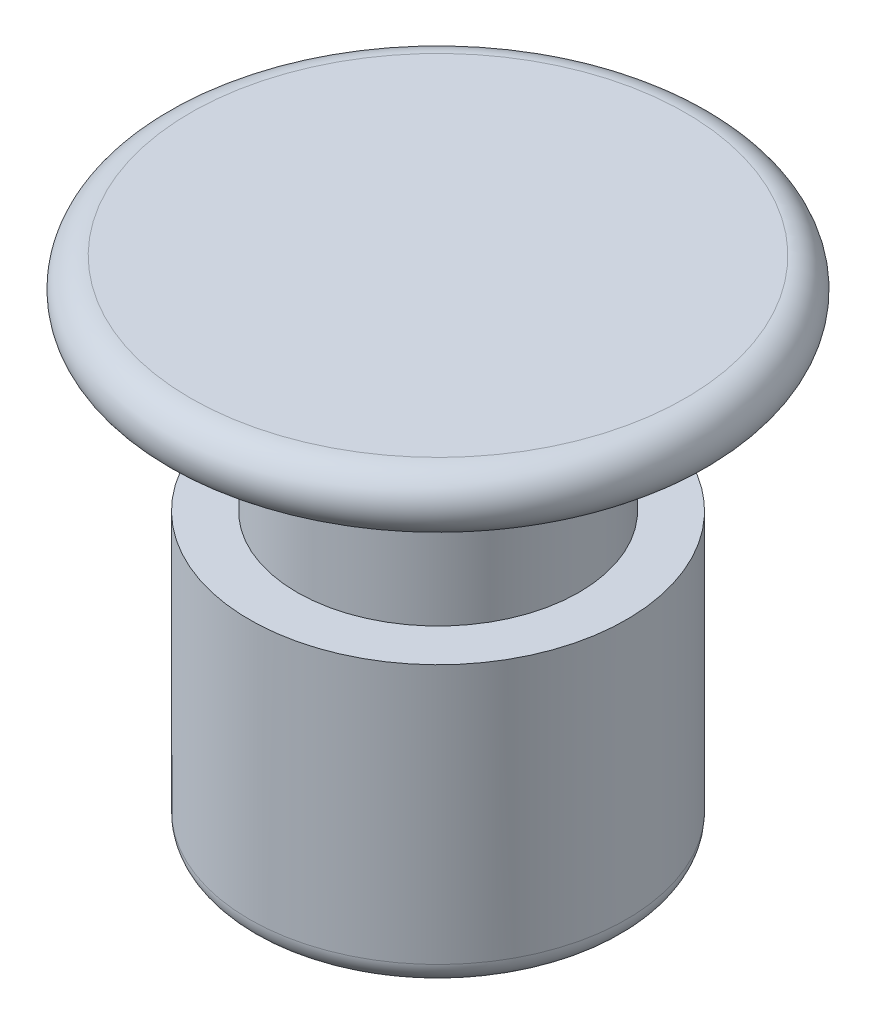
ISO-10303-21;
HEADER;
FILE_DESCRIPTION(('STEP AP214'),'2;1');
FILE_NAME('part.step','',(''),(''),'','','');
FILE_SCHEMA(('AUTOMOTIVE_DESIGN { 1 0 10303 214 1 1 1 1 }'));
ENDSEC;
DATA;
#1=APPLICATION_CONTEXT('core data for automotive mechanical design processes');
#2=APPLICATION_PROTOCOL_DEFINITION('international standard','automotive_design',2000,#1);
#3=PRODUCT_CONTEXT('',#1,'mechanical');
#4=PRODUCT('Part','Part','',(#3));
#5=PRODUCT_RELATED_PRODUCT_CATEGORY('part','',(#4));
#6=PRODUCT_DEFINITION_FORMATION('','',#4);
#7=PRODUCT_DEFINITION_CONTEXT('part definition',#1,'design');
#8=PRODUCT_DEFINITION('design','',#6,#7);
#9=PRODUCT_DEFINITION_SHAPE('','',#8);
#10=(LENGTH_UNIT() NAMED_UNIT(*) SI_UNIT(.MILLI.,.METRE.));
#11=(NAMED_UNIT(*) PLANE_ANGLE_UNIT() SI_UNIT($,.RADIAN.));
#12=(NAMED_UNIT(*) SI_UNIT($,.STERADIAN.) SOLID_ANGLE_UNIT());
#13=UNCERTAINTY_MEASURE_WITH_UNIT(LENGTH_MEASURE(1.E-05),#10,'distance_accuracy_value','');
#14=(GEOMETRIC_REPRESENTATION_CONTEXT(3) GLOBAL_UNCERTAINTY_ASSIGNED_CONTEXT((#13)) GLOBAL_UNIT_ASSIGNED_CONTEXT((#10,
#11,#12)) REPRESENTATION_CONTEXT('',''));
#15=CARTESIAN_POINT('',(0.,0.,0.));
#16=DIRECTION('',(0.,0.,1.));
#17=DIRECTION('',(1.,0.,0.));
#18=AXIS2_PLACEMENT_3D('',#15,#16,#17);
#19=CARTESIAN_POINT('',(0.,94.6088814411395,0.));
#20=DIRECTION('',(0.,1.,0.));
#21=DIRECTION('',(0.,0.,1.));
#22=AXIS2_PLACEMENT_3D('',#19,#20,#21);
#23=CYLINDRICAL_SURFACE('',#22,1.5875);
#24=CARTESIAN_POINT('',(0.,-1.397,0.));
#25=DIRECTION('',(0.,1.,0.));
#26=DIRECTION('',(0.,0.,1.));
#27=AXIS2_PLACEMENT_3D('',#24,#25,#26);
#28=CIRCLE('',#27,1.5875);
#29=CARTESIAN_POINT('',(0.,-1.397,1.5875));
#30=VERTEX_POINT('',#29);
#31=EDGE_CURVE('E54',#30,#30,#28,.T.);
#32=ORIENTED_EDGE('',*,*,#31,.F.);
#33=EDGE_LOOP('',(#32));
#34=FACE_BOUND('',#33,.T.);
#35=CARTESIAN_POINT('',(0.,-2.4892,0.));
#36=DIRECTION('',(0.,-1.,0.));
#37=DIRECTION('',(0.,0.,-1.));
#38=AXIS2_PLACEMENT_3D('',#35,#36,#37);
#39=CIRCLE('',#38,1.5875);
#40=CARTESIAN_POINT('',(0.,-2.4892,-1.5875));
#41=VERTEX_POINT('',#40);
#42=EDGE_CURVE('E42',#41,#41,#39,.T.);
#43=ORIENTED_EDGE('',*,*,#42,.F.);
#44=EDGE_LOOP('',(#43));
#45=FACE_BOUND('',#44,.T.);
#46=ADVANCED_FACE('F31',(#34,#45),#23,.T.);
#47=CARTESIAN_POINT('',(0.,0.,0.));
#48=DIRECTION('',(0.,-1.,0.));
#49=DIRECTION('',(0.,0.,-1.));
#50=AXIS2_PLACEMENT_3D('',#47,#48,#49);
#51=PLANE('',#50);
#52=CARTESIAN_POINT('',(0.,0.,0.));
#53=DIRECTION('',(0.,1.,0.));
#54=DIRECTION('',(0.,0.,1.));
#55=AXIS2_PLACEMENT_3D('',#52,#53,#54);
#56=CIRCLE('',#55,2.78366020445437);
#57=CARTESIAN_POINT('',(0.,0.,2.78366020445437));
#58=VERTEX_POINT('',#57);
#59=EDGE_CURVE('E46',#58,#58,#56,.T.);
#60=ORIENTED_EDGE('',*,*,#59,.T.);
#61=EDGE_LOOP('',(#60));
#62=FACE_BOUND('',#61,.T.);
#63=ADVANCED_FACE('F76',(#62),#51,.F.);
#64=CARTESIAN_POINT('',(0.,-0.327839795545645,0.));
#65=DIRECTION('',(0.,1.,0.));
#66=DIRECTION('',(0.,0.,1.));
#67=AXIS2_PLACEMENT_3D('',#64,#65,#66);
#68=TOROIDAL_SURFACE('',#67,2.78366020445437,0.327839795545645);
#69=ORIENTED_EDGE('',*,*,#59,.F.);
#70=EDGE_LOOP('',(#69));
#71=FACE_BOUND('',#70,.T.);
#72=CARTESIAN_POINT('',(0.,-0.611757386859674,0.));
#73=DIRECTION('',(0.,1.,0.));
#74=DIRECTION('',(0.,0.,1.));
#75=AXIS2_PLACEMENT_3D('',#72,#73,#74);
#76=CIRCLE('',#75,2.94758010222719);
#77=CARTESIAN_POINT('',(0.,-0.611757386859674,2.94758010222719));
#78=VERTEX_POINT('',#77);
#79=EDGE_CURVE('E51',#78,#78,#76,.T.);
#80=ORIENTED_EDGE('',*,*,#79,.T.);
#81=EDGE_LOOP('',(#80));
#82=FACE_BOUND('',#81,.T.);
#83=ADVANCED_FACE('F83',(#71,#82),#68,.T.);
#84=CARTESIAN_POINT('',(0.,-1.397,0.));
#85=DIRECTION('',(0.,1.,0.));
#86=DIRECTION('',(0.,0.,1.));
#87=AXIS2_PLACEMENT_3D('',#84,#85,#86);
#88=CONICAL_SURFACE('',#87,1.5875,1.0471975511966);
#89=ORIENTED_EDGE('',*,*,#79,.F.);
#90=EDGE_LOOP('',(#89));
#91=FACE_BOUND('',#90,.T.);
#92=ORIENTED_EDGE('',*,*,#31,.T.);
#93=EDGE_LOOP('',(#92));
#94=FACE_BOUND('',#93,.T.);
#95=ADVANCED_FACE('F73',(#91,#94),#88,.T.);
#96=CARTESIAN_POINT('',(0.,-2.4892,0.));
#97=DIRECTION('',(0.,-1.,0.));
#98=DIRECTION('',(0.,0.,-1.));
#99=AXIS2_PLACEMENT_3D('',#96,#97,#98);
#100=CYLINDRICAL_SURFACE('',#99,2.1209);
#101=CARTESIAN_POINT('',(0.,-5.4102,0.));
#102=DIRECTION('',(0.,1.,0.));
#103=DIRECTION('',(0.,0.,1.));
#104=AXIS2_PLACEMENT_3D('',#101,#102,#103);
#105=CIRCLE('',#104,2.1209);
#106=CARTESIAN_POINT('',(0.,-5.4102,-2.1209));
#107=VERTEX_POINT('',#106);
#108=EDGE_CURVE('E38',#107,#107,#105,.T.);
#109=CARTESIAN_POINT('',(0.,-2.4892,0.));
#110=DIRECTION('',(0.,-1.,0.));
#111=DIRECTION('',(0.,0.,-1.));
#112=AXIS2_PLACEMENT_3D('',#109,#110,#111);
#113=CIRCLE('',#112,2.1209);
#114=CARTESIAN_POINT('',(0.,-2.4892,-2.1209));
#115=VERTEX_POINT('',#114);
#116=EDGE_CURVE('E57',#115,#115,#113,.T.);
#117=CARTESIAN_POINT('',(0.,-5.4102,-2.1209));
#118=CARTESIAN_POINT('',(0.,-5.37977291666667,-2.1209));
#119=CARTESIAN_POINT('',(0.,-5.34934583333333,-2.1209));
#120=CARTESIAN_POINT('',(0.,-5.28849166666667,-2.1209));
#121=CARTESIAN_POINT('',(0.,-5.25806458333333,-2.1209));
#122=CARTESIAN_POINT('',(0.,-5.19721041666667,-2.1209));
#123=CARTESIAN_POINT('',(0.,-5.16678333333333,-2.1209));
#124=CARTESIAN_POINT('',(0.,-5.10592916666667,-2.1209));
#125=CARTESIAN_POINT('',(0.,-5.07550208333333,-2.1209));
#126=CARTESIAN_POINT('',(0.,-5.01464791666667,-2.1209));
#127=CARTESIAN_POINT('',(0.,-4.98422083333333,-2.1209));
#128=CARTESIAN_POINT('',(0.,-4.92336666666667,-2.1209));
#129=CARTESIAN_POINT('',(0.,-4.89293958333333,-2.1209));
#130=CARTESIAN_POINT('',(0.,-4.83208541666667,-2.1209));
#131=CARTESIAN_POINT('',(0.,-4.80165833333333,-2.1209));
#132=CARTESIAN_POINT('',(0.,-4.74080416666667,-2.1209));
#133=CARTESIAN_POINT('',(0.,-4.71037708333333,-2.1209));
#134=CARTESIAN_POINT('',(0.,-4.64952291666667,-2.1209));
#135=CARTESIAN_POINT('',(0.,-4.61909583333333,-2.1209));
#136=CARTESIAN_POINT('',(0.,-4.55824166666667,-2.1209));
#137=CARTESIAN_POINT('',(0.,-4.52781458333333,-2.1209));
#138=CARTESIAN_POINT('',(0.,-4.46696041666667,-2.1209));
#139=CARTESIAN_POINT('',(0.,-4.43653333333333,-2.1209));
#140=CARTESIAN_POINT('',(0.,-4.37567916666667,-2.1209));
#141=CARTESIAN_POINT('',(0.,-4.34525208333333,-2.1209));
#142=CARTESIAN_POINT('',(0.,-4.28439791666667,-2.1209));
#143=CARTESIAN_POINT('',(0.,-4.25397083333333,-2.1209));
#144=CARTESIAN_POINT('',(0.,-4.19311666666667,-2.1209));
#145=CARTESIAN_POINT('',(0.,-4.16268958333333,-2.1209));
#146=CARTESIAN_POINT('',(0.,-4.10183541666667,-2.1209));
#147=CARTESIAN_POINT('',(0.,-4.07140833333333,-2.1209));
#148=CARTESIAN_POINT('',(0.,-4.01055416666667,-2.1209));
#149=CARTESIAN_POINT('',(0.,-3.98012708333333,-2.1209));
#150=CARTESIAN_POINT('',(0.,-3.91927291666667,-2.1209));
#151=CARTESIAN_POINT('',(0.,-3.88884583333333,-2.1209));
#152=CARTESIAN_POINT('',(0.,-3.82799166666667,-2.1209));
#153=CARTESIAN_POINT('',(0.,-3.79756458333333,-2.1209));
#154=CARTESIAN_POINT('',(0.,-3.73671041666667,-2.1209));
#155=CARTESIAN_POINT('',(0.,-3.70628333333333,-2.1209));
#156=CARTESIAN_POINT('',(0.,-3.64542916666667,-2.1209));
#157=CARTESIAN_POINT('',(0.,-3.61500208333333,-2.1209));
#158=CARTESIAN_POINT('',(0.,-3.55414791666667,-2.1209));
#159=CARTESIAN_POINT('',(0.,-3.52372083333333,-2.1209));
#160=CARTESIAN_POINT('',(0.,-3.46286666666667,-2.1209));
#161=CARTESIAN_POINT('',(0.,-3.43243958333333,-2.1209));
#162=CARTESIAN_POINT('',(0.,-3.37158541666667,-2.1209));
#163=CARTESIAN_POINT('',(0.,-3.34115833333333,-2.1209));
#164=CARTESIAN_POINT('',(0.,-3.28030416666667,-2.1209));
#165=CARTESIAN_POINT('',(0.,-3.24987708333333,-2.1209));
#166=CARTESIAN_POINT('',(0.,-3.18902291666667,-2.1209));
#167=CARTESIAN_POINT('',(0.,-3.15859583333333,-2.1209));
#168=CARTESIAN_POINT('',(0.,-3.09774166666667,-2.1209));
#169=CARTESIAN_POINT('',(0.,-3.06731458333333,-2.1209));
#170=CARTESIAN_POINT('',(0.,-3.00646041666667,-2.1209));
#171=CARTESIAN_POINT('',(0.,-2.97603333333333,-2.1209));
#172=CARTESIAN_POINT('',(0.,-2.91517916666667,-2.1209));
#173=CARTESIAN_POINT('',(0.,-2.88475208333333,-2.1209));
#174=CARTESIAN_POINT('',(0.,-2.82389791666667,-2.1209));
#175=CARTESIAN_POINT('',(0.,-2.79347083333333,-2.1209));
#176=CARTESIAN_POINT('',(0.,-2.73261666666667,-2.1209));
#177=CARTESIAN_POINT('',(0.,-2.70218958333333,-2.1209));
#178=CARTESIAN_POINT('',(0.,-2.64133541666667,-2.1209));
#179=CARTESIAN_POINT('',(0.,-2.61090833333333,-2.1209));
#180=CARTESIAN_POINT('',(0.,-2.55005416666667,-2.1209));
#181=CARTESIAN_POINT('',(0.,-2.51962708333333,-2.1209));
#182=CARTESIAN_POINT('',(0.,-2.4892,-2.1209));
#183=B_SPLINE_CURVE_WITH_KNOTS('',3,(#117,#118,#119,#120,#121,#122,#123,#124,#125,#126,#127,
#128,#129,#130,#131,#132,#133,#134,#135,#136,#137,#138,#139,#140,#141,#142,#143,#144,#145,#146,
#147,#148,#149,#150,#151,#152,#153,#154,#155,#156,#157,#158,#159,#160,#161,#162,#163,#164,#165,
#166,#167,#168,#169,#170,#171,#172,#173,#174,#175,#176,#177,#178,#179,#180,#181,#182),
.UNSPECIFIED.,.F.,.F.,(4,2,2,2,2,2,2,2,2,2,2,2,2,2,2,2,2,2,2,2,2,2,2,2,2,2,2,2,2,2,2,2,4),(0.,
0.0912812500000002,0.1825625,0.27384375,0.365124999999999,0.456406249999999,0.5476875,
0.63896875,0.73025,0.82153125,0.9128125,1.00409375,1.095375,1.18665625,1.2779375,1.36921875,
1.4605,1.55178125,1.6430625,1.73434375,1.825625,1.91690625,2.0081875,2.09946875,2.19075,
2.28203125,2.3733125,2.46459375,2.555875,2.64715625,2.7384375,2.82971875,2.921),.UNSPECIFIED.);
#184=EDGE_CURVE('BSEAM61',#107,#115,#183,.T.);
#185=ORIENTED_EDGE('',*,*,#108,.T.);
#186=ORIENTED_EDGE('',*,*,#116,.T.);
#187=ORIENTED_EDGE('',*,*,#184,.T.);
#188=ORIENTED_EDGE('',*,*,#184,.F.);
#189=EDGE_LOOP('',(#185,#187,#186,#188));
#190=FACE_BOUND('',#189,.T.);
#191=ADVANCED_FACE('F61',(#190),#100,.T.);
#192=CARTESIAN_POINT('',(0.,-2.4892,0.));
#193=DIRECTION('',(0.,-1.,0.));
#194=DIRECTION('',(0.,0.,-1.));
#195=AXIS2_PLACEMENT_3D('',#192,#193,#194);
#196=PLANE('',#195);
#197=ORIENTED_EDGE('',*,*,#42,.T.);
#198=EDGE_LOOP('',(#197));
#199=FACE_BOUND('',#198,.T.);
#200=ORIENTED_EDGE('',*,*,#116,.F.);
#201=EDGE_LOOP('',(#200));
#202=FACE_BOUND('',#201,.T.);
#203=ADVANCED_FACE('F63',(#199,#202),#196,.F.);
#204=CARTESIAN_POINT('',(0.,-5.6642,0.));
#205=DIRECTION('',(0.,1.,0.));
#206=DIRECTION('',(0.,0.,1.));
#207=AXIS2_PLACEMENT_3D('',#204,#205,#206);
#208=PLANE('',#207);
#209=CARTESIAN_POINT('',(0.,-5.6642,0.));
#210=DIRECTION('',(0.,1.,0.));
#211=DIRECTION('',(0.,0.,1.));
#212=AXIS2_PLACEMENT_3D('',#209,#210,#211);
#213=CIRCLE('',#212,1.8669);
#214=CARTESIAN_POINT('',(0.,-5.6642,1.8669));
#215=VERTEX_POINT('',#214);
#216=EDGE_CURVE('E10',#215,#215,#213,.F.);
#217=ORIENTED_EDGE('',*,*,#216,.T.);
#218=EDGE_LOOP('',(#217));
#219=FACE_BOUND('',#218,.T.);
#220=ADVANCED_FACE('F65',(#219),#208,.F.);
#221=CARTESIAN_POINT('',(0.,-5.4102,0.));
#222=DIRECTION('',(0.,1.,0.));
#223=DIRECTION('',(0.,0.,1.));
#224=AXIS2_PLACEMENT_3D('',#221,#222,#223);
#225=TOROIDAL_SURFACE('',#224,1.8669,0.254);
#226=ORIENTED_EDGE('',*,*,#216,.F.);
#227=EDGE_LOOP('',(#226));
#228=FACE_BOUND('',#227,.T.);
#229=ORIENTED_EDGE('',*,*,#108,.F.);
#230=EDGE_LOOP('',(#229));
#231=FACE_BOUND('',#230,.T.);
#232=ADVANCED_FACE('F33',(#228,#231),#225,.T.);
#233=CLOSED_SHELL('',(#46,#63,#83,#95,#191,#203,#220,#232));
#234=MANIFOLD_SOLID_BREP('B2',#233);
#235=ADVANCED_BREP_SHAPE_REPRESENTATION('',(#18,#234),#14);
#236=SHAPE_DEFINITION_REPRESENTATION(#9,#235);
ENDSEC;
END-ISO-10303-21;
